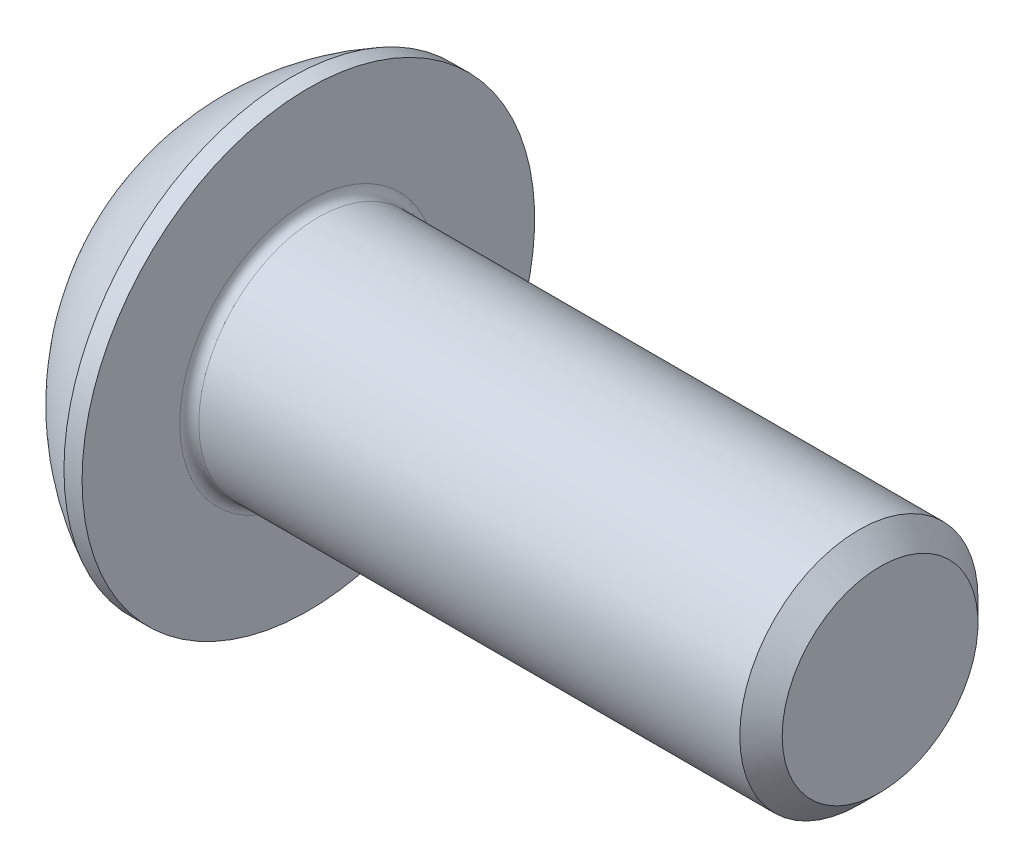
ISO-10303-21;
HEADER;
FILE_DESCRIPTION(('STEP AP214'),'2;1');
FILE_NAME('part.step','',(''),(''),'','','');
FILE_SCHEMA(('AUTOMOTIVE_DESIGN { 1 0 10303 214 1 1 1 1 }'));
ENDSEC;
DATA;
#1=APPLICATION_CONTEXT('core data for automotive mechanical design processes');
#2=APPLICATION_PROTOCOL_DEFINITION('international standard','automotive_design',2000,#1);
#3=PRODUCT_CONTEXT('',#1,'mechanical');
#4=PRODUCT('Part','Part','',(#3));
#5=PRODUCT_RELATED_PRODUCT_CATEGORY('part','',(#4));
#6=PRODUCT_DEFINITION_FORMATION('','',#4);
#7=PRODUCT_DEFINITION_CONTEXT('part definition',#1,'design');
#8=PRODUCT_DEFINITION('design','',#6,#7);
#9=PRODUCT_DEFINITION_SHAPE('','',#8);
#10=(LENGTH_UNIT() NAMED_UNIT(*) SI_UNIT(.MILLI.,.METRE.));
#11=(NAMED_UNIT(*) PLANE_ANGLE_UNIT() SI_UNIT($,.RADIAN.));
#12=(NAMED_UNIT(*) SI_UNIT($,.STERADIAN.) SOLID_ANGLE_UNIT());
#13=UNCERTAINTY_MEASURE_WITH_UNIT(LENGTH_MEASURE(1.E-05),#10,'distance_accuracy_value','');
#14=(GEOMETRIC_REPRESENTATION_CONTEXT(3) GLOBAL_UNCERTAINTY_ASSIGNED_CONTEXT((#13)) GLOBAL_UNIT_ASSIGNED_CONTEXT((#10,
#11,#12)) REPRESENTATION_CONTEXT('',''));
#15=CARTESIAN_POINT('',(0.,0.,0.));
#16=DIRECTION('',(0.,0.,1.));
#17=DIRECTION('',(1.,0.,0.));
#18=AXIS2_PLACEMENT_3D('',#15,#16,#17);
#19=CARTESIAN_POINT('',(0.,0.,0.));
#20=DIRECTION('',(-1.,0.,0.));
#21=DIRECTION('',(0.,0.,1.));
#22=AXIS2_PLACEMENT_3D('',#19,#20,#21);
#23=PLANE('',#22);
#24=CARTESIAN_POINT('',(0.,0.,0.));
#25=DIRECTION('',(-1.,0.,0.));
#26=DIRECTION('',(0.,0.,1.));
#27=AXIS2_PLACEMENT_3D('',#24,#25,#26);
#28=CIRCLE('',#27,2.375);
#29=CARTESIAN_POINT('',(0.,2.375,0.));
#30=VERTEX_POINT('',#29);
#31=EDGE_CURVE('E159',#30,#30,#28,.T.);
#32=ORIENTED_EDGE('',*,*,#31,.T.);
#33=EDGE_LOOP('',(#32));
#34=FACE_BOUND('',#33,.T.);
#35=DIRECTION('',(0.,-1.,0.));
#36=VECTOR('',#35,1.);
#37=CARTESIAN_POINT('',(0.,-0.866025403784438,1.5));
#38=LINE('',#37,#36);
#39=CARTESIAN_POINT('',(0.,0.86602540378444,1.5));
#40=VERTEX_POINT('',#39);
#41=CARTESIAN_POINT('',(0.,-0.866025403784438,1.5));
#42=VERTEX_POINT('',#41);
#43=EDGE_CURVE('E54',#40,#42,#38,.T.);
#44=ORIENTED_EDGE('',*,*,#43,.T.);
#45=DIRECTION('',(0.,-0.5,-0.866025403784439));
#46=VECTOR('',#45,1.);
#47=CARTESIAN_POINT('',(0.,-1.73205080756888,0.));
#48=LINE('',#47,#46);
#49=CARTESIAN_POINT('',(0.,-1.73205080756888,0.));
#50=VERTEX_POINT('',#49);
#51=EDGE_CURVE('E279',#42,#50,#48,.T.);
#52=ORIENTED_EDGE('',*,*,#51,.T.);
#53=DIRECTION('',(0.,0.5,-0.866025403784438));
#54=VECTOR('',#53,1.);
#55=CARTESIAN_POINT('',(0.,-0.866025403784438,-1.5));
#56=LINE('',#55,#54);
#57=CARTESIAN_POINT('',(0.,-0.866025403784438,-1.5));
#58=VERTEX_POINT('',#57);
#59=EDGE_CURVE('E134',#50,#58,#56,.T.);
#60=ORIENTED_EDGE('',*,*,#59,.T.);
#61=DIRECTION('',(0.,1.,0.));
#62=VECTOR('',#61,1.);
#63=CARTESIAN_POINT('',(0.,0.86602540378444,-1.5));
#64=LINE('',#63,#62);
#65=CARTESIAN_POINT('',(0.,0.86602540378444,-1.5));
#66=VERTEX_POINT('',#65);
#67=EDGE_CURVE('E282',#58,#66,#64,.T.);
#68=ORIENTED_EDGE('',*,*,#67,.T.);
#69=DIRECTION('',(0.,0.5,0.866025403784439));
#70=VECTOR('',#69,1.);
#71=CARTESIAN_POINT('',(0.,1.73205080756888,0.));
#72=LINE('',#71,#70);
#73=CARTESIAN_POINT('',(0.,1.73205080756888,0.));
#74=VERTEX_POINT('',#73);
#75=EDGE_CURVE('E284',#66,#74,#72,.T.);
#76=ORIENTED_EDGE('',*,*,#75,.T.);
#77=DIRECTION('',(0.,-0.5,0.866025403784439));
#78=VECTOR('',#77,1.);
#79=CARTESIAN_POINT('',(0.,0.86602540378444,1.5));
#80=LINE('',#79,#78);
#81=EDGE_CURVE('E286',#74,#40,#80,.T.);
#82=ORIENTED_EDGE('',*,*,#81,.T.);
#83=EDGE_LOOP('',(#44,#52,#60,#68,#76,#82));
#84=FACE_BOUND('',#83,.T.);
#85=ADVANCED_FACE('F39',(#34,#84),#23,.T.);
#86=CARTESIAN_POINT('',(4.75501582278481,0.,0.));
#87=DIRECTION('',(-1.,0.,0.));
#88=DIRECTION('',(0.,1.,0.));
#89=AXIS2_PLACEMENT_3D('',#86,#87,#88);
#90=SPHERICAL_SURFACE('',#89,5.3151482081814);
#91=CARTESIAN_POINT('',(2.37,0.,0.));
#92=DIRECTION('',(-1.,0.,0.));
#93=DIRECTION('',(0.,0.,1.));
#94=AXIS2_PLACEMENT_3D('',#91,#92,#93);
#95=CIRCLE('',#94,4.75);
#96=CARTESIAN_POINT('',(2.37,4.75,0.));
#97=VERTEX_POINT('',#96);
#98=EDGE_CURVE('E156',#97,#97,#95,.T.);
#99=CARTESIAN_POINT('',(2.37,4.75,0.));
#100=CARTESIAN_POINT('',(2.33822259048669,4.7340443473251,0.));
#101=CARTESIAN_POINT('',(2.30660534291523,4.71776971995817,0.));
#102=CARTESIAN_POINT('',(2.24370380094997,4.68458927158339,0.));
#103=CARTESIAN_POINT('',(2.21241950655618,4.66768345057554,0.));
#104=CARTESIAN_POINT('',(2.15019650024021,4.6332473706621,0.));
#105=CARTESIAN_POINT('',(2.11925778831804,4.6157171117565,0.));
#106=CARTESIAN_POINT('',(2.05773840110808,4.58003923142984,0.));
#107=CARTESIAN_POINT('',(2.02715772582028,4.56189161000878,0.));
#108=CARTESIAN_POINT('',(1.96636673145741,4.52498631044657,0.));
#109=CARTESIAN_POINT('',(1.93615641238234,4.50622863230541,0.));
#110=CARTESIAN_POINT('',(1.87611829826807,4.46811077571318,0.));
#111=CARTESIAN_POINT('',(1.84629050322888,4.4487505972621,0.));
#112=CARTESIAN_POINT('',(1.78702945162455,4.40943553782984,0.));
#113=CARTESIAN_POINT('',(1.75759619505941,4.38948065684865,0.));
#114=CARTESIAN_POINT('',(1.69913607574061,4.34898423002648,0.));
#115=CARTESIAN_POINT('',(1.67010921298694,4.32844268418548,0.));
#116=CARTESIAN_POINT('',(1.61247357298735,4.28678120152175,0.));
#117=CARTESIAN_POINT('',(1.58386479574144,4.265661264699,0.));
#118=CARTESIAN_POINT('',(1.52707685004032,4.22285150694424,0.));
#119=CARTESIAN_POINT('',(1.49889768158512,4.20116168601223,0.));
#120=CARTESIAN_POINT('',(1.44298030371049,4.15722089644741,0.));
#121=CARTESIAN_POINT('',(1.41524209429107,4.13496992781461,0.));
#122=CARTESIAN_POINT('',(1.36021780711889,4.08991580528235,0.));
#123=CARTESIAN_POINT('',(1.33293172936613,4.06711265138288,0.));
#124=CARTESIAN_POINT('',(1.278822696045,4.02096334316477,0.));
#125=CARTESIAN_POINT('',(1.25199974047662,3.99761718884614,0.));
#126=CARTESIAN_POINT('',(1.19882775550162,3.95039128335163,0.));
#127=CARTESIAN_POINT('',(1.172478726095,3.92651153217576,0.));
#128=CARTESIAN_POINT('',(1.1202652065289,3.87822805145535,0.));
#129=CARTESIAN_POINT('',(1.09440071636942,3.85382432191081,0.));
#130=CARTESIAN_POINT('',(1.04316669321618,3.8045027139941,0.));
#131=CARTESIAN_POINT('',(1.01779716022241,3.77958483562192,0.));
#132=CARTESIAN_POINT('',(0.9675632699561,3.72924496668416,0.));
#133=CARTESIAN_POINT('',(0.942698912683562,3.70382297611859,0.));
#134=CARTESIAN_POINT('',(0.89348538893628,3.65248512247887,0.));
#135=CARTESIAN_POINT('',(0.869136222461536,3.62656925940472,0.));
#136=CARTESIAN_POINT('',(0.82096288787349,3.57425409935884,0.));
#137=CARTESIAN_POINT('',(0.797138719760188,3.54785480238711,0.));
#138=CARTESIAN_POINT('',(0.750024977995378,3.49458340787865,0.));
#139=CARTESIAN_POINT('',(0.726735404343869,3.46771131034191,0.));
#140=CARTESIAN_POINT('',(0.680700232274541,3.41350513847464,0.));
#141=CARTESIAN_POINT('',(0.657954633856721,3.3861710641441,0.));
#142=CARTESIAN_POINT('',(0.613016573919583,3.33105194853939,0.));
#143=CARTESIAN_POINT('',(0.590824112400263,3.30326690726522,0.));
#144=CARTESIAN_POINT('',(0.547001265128254,3.24725704926748,0.));
#145=CARTESIAN_POINT('',(0.525370879375564,3.21903223254391,0.));
#146=CARTESIAN_POINT('',(0.48268089610549,3.16215419227901,0.));
#147=CARTESIAN_POINT('',(0.461621298588105,3.13350096873769,0.));
#148=CARTESIAN_POINT('',(0.420081374357154,3.07577765602272,0.));
#149=CARTESIAN_POINT('',(0.399601047643587,3.04670756684908,0.));
#150=CARTESIAN_POINT('',(0.359227914239947,2.98816223197683,0.));
#151=CARTESIAN_POINT('',(0.339335107549873,2.95868698627821,0.));
#152=CARTESIAN_POINT('',(0.300145026860787,2.89934321060632,0.));
#153=CARTESIAN_POINT('',(0.280847752861776,2.86947468063304,0.));
#154=CARTESIAN_POINT('',(0.242856509997139,2.80935636725696,0.));
#155=CARTESIAN_POINT('',(0.224162541131514,2.77910658385416,0.));
#156=CARTESIAN_POINT('',(0.187385439283607,2.71823794734018,0.));
#157=CARTESIAN_POINT('',(0.169302306301325,2.68761909422898,0.));
#158=CARTESIAN_POINT('',(0.133754156035989,2.626024653246,0.));
#159=CARTESIAN_POINT('',(0.116289138752934,2.59504906537422,0.));
#160=CARTESIAN_POINT('',(0.081984269005742,2.53275362391635,0.));
#161=CARTESIAN_POINT('',(0.0651444165416041,2.50143377033028,0.));
#162=CARTESIAN_POINT('',(0.03209660554443,2.43846244094735,0.));
#163=CARTESIAN_POINT('',(0.0158886470113938,2.40681096515049,0.));
#164=CARTESIAN_POINT('',(0.,2.375,0.));
#165=B_SPLINE_CURVE_WITH_KNOTS('',3,(#99,#100,#101,#102,#103,#104,#105,#106,#107,#108,#109,#110,
#111,#112,#113,#114,#115,#116,#117,#118,#119,#120,#121,#122,#123,#124,#125,#126,#127,#128,#129,
#130,#131,#132,#133,#134,#135,#136,#137,#138,#139,#140,#141,#142,#143,#144,#145,#146,#147,#148,
#149,#150,#151,#152,#153,#154,#155,#156,#157,#158,#159,#160,#161,#162,#163,#164),.UNSPECIFIED.,
.F.,.F.,(4,2,2,2,2,2,2,2,2,2,2,2,2,2,2,2,2,2,2,2,2,2,2,2,2,2,2,2,2,2,2,2,4),(0.,
0.106672849678272,0.213345699356545,0.320018549034817,0.426691398713089,0.533364248391363,
0.640037098069634,0.746709947747907,0.853382797426179,0.960055647104452,1.06672849678272,
1.173401346461,1.28007419613927,1.38674704581754,1.49341989549581,1.60009274517409,
1.70676559485236,1.81343844453063,1.9201112942089,2.02678414388718,2.13345699356545,
2.24012984324372,2.34680269292199,2.45347554260027,2.56014839227854,2.66682124195681,
2.77349409163508,2.88016694131336,2.98683979099163,3.0935126406699,3.20018549034817,
3.30685834002645,3.41353118970472),.UNSPECIFIED.);
#166=EDGE_CURVE('BSEAM180',#97,#30,#165,.T.);
#167=ORIENTED_EDGE('',*,*,#98,.T.);
#168=ORIENTED_EDGE('',*,*,#31,.F.);
#169=ORIENTED_EDGE('',*,*,#166,.T.);
#170=ORIENTED_EDGE('',*,*,#166,.F.);
#171=EDGE_LOOP('',(#167,#169,#168,#170));
#172=FACE_BOUND('',#171,.T.);
#173=ADVANCED_FACE('F180',(#172),#90,.T.);
#174=CARTESIAN_POINT('',(0.,0.,0.));
#175=DIRECTION('',(-1.,0.,0.));
#176=DIRECTION('',(0.,0.,1.));
#177=AXIS2_PLACEMENT_3D('',#174,#175,#176);
#178=CYLINDRICAL_SURFACE('',#177,4.75);
#179=ORIENTED_EDGE('',*,*,#98,.F.);
#180=EDGE_LOOP('',(#179));
#181=FACE_BOUND('',#180,.T.);
#182=CARTESIAN_POINT('',(2.75,0.,0.));
#183=DIRECTION('',(-1.,0.,0.));
#184=DIRECTION('',(0.,0.,1.));
#185=AXIS2_PLACEMENT_3D('',#182,#183,#184);
#186=CIRCLE('',#185,4.75);
#187=CARTESIAN_POINT('',(2.75,0.,4.75));
#188=VERTEX_POINT('',#187);
#189=EDGE_CURVE('E153',#188,#188,#186,.T.);
#190=ORIENTED_EDGE('',*,*,#189,.T.);
#191=EDGE_LOOP('',(#190));
#192=FACE_BOUND('',#191,.T.);
#193=ADVANCED_FACE('F185',(#181,#192),#178,.T.);
#194=CARTESIAN_POINT('',(2.75,2.49999999999999,0.));
#195=DIRECTION('',(-1.,0.,0.));
#196=DIRECTION('',(0.,0.,1.));
#197=AXIS2_PLACEMENT_3D('',#194,#195,#196);
#198=PLANE('',#197);
#199=CARTESIAN_POINT('',(2.75,0.,0.));
#200=DIRECTION('',(-1.,0.,0.));
#201=DIRECTION('',(0.,0.,1.));
#202=AXIS2_PLACEMENT_3D('',#199,#200,#201);
#203=CIRCLE('',#202,2.7);
#204=CARTESIAN_POINT('',(2.75,0.,2.7));
#205=VERTEX_POINT('',#204);
#206=EDGE_CURVE('E47',#205,#205,#203,.T.);
#207=ORIENTED_EDGE('',*,*,#206,.T.);
#208=EDGE_LOOP('',(#207));
#209=FACE_BOUND('',#208,.T.);
#210=ORIENTED_EDGE('',*,*,#189,.F.);
#211=EDGE_LOOP('',(#210));
#212=FACE_BOUND('',#211,.T.);
#213=ADVANCED_FACE('F164',(#209,#212),#198,.F.);
#214=CARTESIAN_POINT('',(0.,0.,0.));
#215=DIRECTION('',(-1.,0.,0.));
#216=DIRECTION('',(0.,0.,1.));
#217=AXIS2_PLACEMENT_3D('',#214,#215,#216);
#218=CYLINDRICAL_SURFACE('',#217,2.5);
#219=CARTESIAN_POINT('',(2.95,0.,0.));
#220=DIRECTION('',(-1.,0.,0.));
#221=DIRECTION('',(0.,0.,1.));
#222=AXIS2_PLACEMENT_3D('',#219,#220,#221);
#223=CIRCLE('',#222,2.5);
#224=CARTESIAN_POINT('',(2.95,0.,2.5));
#225=VERTEX_POINT('',#224);
#226=EDGE_CURVE('E11',#225,#225,#223,.F.);
#227=ORIENTED_EDGE('',*,*,#226,.T.);
#228=EDGE_LOOP('',(#227));
#229=FACE_BOUND('',#228,.T.);
#230=CARTESIAN_POINT('',(14.305,0.,0.));
#231=DIRECTION('',(-1.,0.,0.));
#232=DIRECTION('',(0.,0.,1.));
#233=AXIS2_PLACEMENT_3D('',#230,#231,#232);
#234=CIRCLE('',#233,2.5);
#235=CARTESIAN_POINT('',(14.305,0.,2.5));
#236=VERTEX_POINT('',#235);
#237=EDGE_CURVE('E150',#236,#236,#234,.T.);
#238=ORIENTED_EDGE('',*,*,#237,.T.);
#239=EDGE_LOOP('',(#238));
#240=FACE_BOUND('',#239,.T.);
#241=ADVANCED_FACE('F194',(#229,#240),#218,.T.);
#242=CARTESIAN_POINT('',(14.75,0.,0.));
#243=DIRECTION('',(-1.,0.,0.));
#244=DIRECTION('',(0.,0.,1.));
#245=AXIS2_PLACEMENT_3D('',#242,#243,#244);
#246=CONICAL_SURFACE('',#245,2.055,0.785398163397446);
#247=ORIENTED_EDGE('',*,*,#237,.F.);
#248=EDGE_LOOP('',(#247));
#249=FACE_BOUND('',#248,.T.);
#250=CARTESIAN_POINT('',(14.75,0.,0.));
#251=DIRECTION('',(-1.,0.,0.));
#252=DIRECTION('',(0.,0.,1.));
#253=AXIS2_PLACEMENT_3D('',#250,#251,#252);
#254=CIRCLE('',#253,2.055);
#255=CARTESIAN_POINT('',(14.75,0.,2.055));
#256=VERTEX_POINT('',#255);
#257=EDGE_CURVE('E146',#256,#256,#254,.T.);
#258=ORIENTED_EDGE('',*,*,#257,.T.);
#259=EDGE_LOOP('',(#258));
#260=FACE_BOUND('',#259,.T.);
#261=ADVANCED_FACE('F175',(#249,#260),#246,.T.);
#262=CARTESIAN_POINT('',(14.75,0.,0.));
#263=DIRECTION('',(-1.,0.,0.));
#264=DIRECTION('',(0.,0.,1.));
#265=AXIS2_PLACEMENT_3D('',#262,#263,#264);
#266=PLANE('',#265);
#267=ORIENTED_EDGE('',*,*,#257,.F.);
#268=EDGE_LOOP('',(#267));
#269=FACE_BOUND('',#268,.T.);
#270=ADVANCED_FACE('F168',(#269),#266,.F.);
#271=CARTESIAN_POINT('',(2.95,0.,0.));
#272=DIRECTION('',(-1.,0.,0.));
#273=DIRECTION('',(0.,0.,1.));
#274=AXIS2_PLACEMENT_3D('',#271,#272,#273);
#275=TOROIDAL_SURFACE('',#274,2.7,0.2);
#276=ORIENTED_EDGE('',*,*,#226,.F.);
#277=EDGE_LOOP('',(#276));
#278=FACE_BOUND('',#277,.T.);
#279=ORIENTED_EDGE('',*,*,#206,.F.);
#280=EDGE_LOOP('',(#279));
#281=FACE_BOUND('',#280,.T.);
#282=ADVANCED_FACE('F41',(#278,#281),#275,.F.);
#283=CARTESIAN_POINT('',(1.56,-1.73205080756888,0.));
#284=DIRECTION('',(0.,0.866025403784438,-0.5));
#285=DIRECTION('',(0.,0.5,0.866025403784439));
#286=AXIS2_PLACEMENT_3D('',#283,#284,#285);
#287=PLANE('',#286);
#288=DIRECTION('',(0.,-0.5,-0.866025403784439));
#289=VECTOR('',#288,1.);
#290=CARTESIAN_POINT('',(1.56,-1.73205080756888,0.));
#291=LINE('',#290,#289);
#292=CARTESIAN_POINT('',(1.56,-0.866025403784438,1.5));
#293=VERTEX_POINT('',#292);
#294=CARTESIAN_POINT('',(1.56,-1.29903810567666,0.75));
#295=VERTEX_POINT('',#294);
#296=EDGE_CURVE('E120',#293,#295,#291,.T.);
#297=ORIENTED_EDGE('',*,*,#296,.T.);
#298=CARTESIAN_POINT('',(1.56,-1.73205080756888,0.));
#299=VERTEX_POINT('',#298);
#300=EDGE_CURVE('E115',#295,#299,#291,.T.);
#301=ORIENTED_EDGE('',*,*,#300,.T.);
#302=DIRECTION('',(-1.,0.,0.));
#303=VECTOR('',#302,1.);
#304=CARTESIAN_POINT('',(1.56,-1.73205080756888,0.));
#305=LINE('',#304,#303);
#306=EDGE_CURVE('E117',#299,#50,#305,.T.);
#307=ORIENTED_EDGE('',*,*,#306,.T.);
#308=ORIENTED_EDGE('',*,*,#51,.F.);
#309=DIRECTION('',(-1.,0.,0.));
#310=VECTOR('',#309,1.);
#311=CARTESIAN_POINT('',(1.56,-0.866025403784438,1.5));
#312=LINE('',#311,#310);
#313=EDGE_CURVE('E275',#293,#42,#312,.T.);
#314=ORIENTED_EDGE('',*,*,#313,.F.);
#315=EDGE_LOOP('',(#297,#301,#307,#308,#314));
#316=FACE_BOUND('',#315,.T.);
#317=ADVANCED_FACE('F116',(#316),#287,.T.);
#318=CARTESIAN_POINT('',(1.56,-0.866025403784438,-1.5));
#319=DIRECTION('',(0.,0.866025403784438,0.5));
#320=DIRECTION('',(0.,-0.5,0.866025403784439));
#321=AXIS2_PLACEMENT_3D('',#318,#319,#320);
#322=PLANE('',#321);
#323=DIRECTION('',(0.,0.5,-0.866025403784438));
#324=VECTOR('',#323,1.);
#325=CARTESIAN_POINT('',(1.56,-0.866025403784438,-1.5));
#326=LINE('',#325,#324);
#327=CARTESIAN_POINT('',(1.56,-1.29903810567666,-0.75));
#328=VERTEX_POINT('',#327);
#329=EDGE_CURVE('E62',#299,#328,#326,.T.);
#330=ORIENTED_EDGE('',*,*,#329,.T.);
#331=CARTESIAN_POINT('',(1.56,-0.866025403784438,-1.5));
#332=VERTEX_POINT('',#331);
#333=EDGE_CURVE('E129',#328,#332,#326,.T.);
#334=ORIENTED_EDGE('',*,*,#333,.T.);
#335=DIRECTION('',(-1.,0.,0.));
#336=VECTOR('',#335,1.);
#337=CARTESIAN_POINT('',(1.56,-0.866025403784438,-1.5));
#338=LINE('',#337,#336);
#339=EDGE_CURVE('E136',#332,#58,#338,.T.);
#340=ORIENTED_EDGE('',*,*,#339,.T.);
#341=ORIENTED_EDGE('',*,*,#59,.F.);
#342=ORIENTED_EDGE('',*,*,#306,.F.);
#343=EDGE_LOOP('',(#330,#334,#340,#341,#342));
#344=FACE_BOUND('',#343,.T.);
#345=ADVANCED_FACE('F132',(#344),#322,.T.);
#346=CARTESIAN_POINT('',(1.56,0.86602540378444,-1.5));
#347=DIRECTION('',(0.,0.,1.));
#348=DIRECTION('',(0.,-1.,0.));
#349=AXIS2_PLACEMENT_3D('',#346,#347,#348);
#350=PLANE('',#349);
#351=DIRECTION('',(0.,1.,0.));
#352=VECTOR('',#351,1.);
#353=CARTESIAN_POINT('',(1.56,0.86602540378444,-1.5));
#354=LINE('',#353,#352);
#355=CARTESIAN_POINT('',(1.56,0.,-1.5));
#356=VERTEX_POINT('',#355);
#357=EDGE_CURVE('E256',#332,#356,#354,.T.);
#358=ORIENTED_EDGE('',*,*,#357,.T.);
#359=CARTESIAN_POINT('',(1.56,0.86602540378444,-1.5));
#360=VERTEX_POINT('',#359);
#361=EDGE_CURVE('E128',#356,#360,#354,.T.);
#362=ORIENTED_EDGE('',*,*,#361,.T.);
#363=DIRECTION('',(-1.,0.,0.));
#364=VECTOR('',#363,1.);
#365=CARTESIAN_POINT('',(1.56,0.86602540378444,-1.5));
#366=LINE('',#365,#364);
#367=EDGE_CURVE('E141',#360,#66,#366,.T.);
#368=ORIENTED_EDGE('',*,*,#367,.T.);
#369=ORIENTED_EDGE('',*,*,#67,.F.);
#370=ORIENTED_EDGE('',*,*,#339,.F.);
#371=EDGE_LOOP('',(#358,#362,#368,#369,#370));
#372=FACE_BOUND('',#371,.T.);
#373=ADVANCED_FACE('F208',(#372),#350,.T.);
#374=CARTESIAN_POINT('',(1.56,1.73205080756888,0.));
#375=DIRECTION('',(0.,-0.866025403784439,0.5));
#376=DIRECTION('',(0.,-0.5,-0.866025403784439));
#377=AXIS2_PLACEMENT_3D('',#374,#375,#376);
#378=PLANE('',#377);
#379=DIRECTION('',(0.,0.5,0.866025403784439));
#380=VECTOR('',#379,1.);
#381=CARTESIAN_POINT('',(1.56,1.73205080756888,0.));
#382=LINE('',#381,#380);
#383=CARTESIAN_POINT('',(1.56,1.29903810567666,-0.750000000000001));
#384=VERTEX_POINT('',#383);
#385=EDGE_CURVE('E245',#360,#384,#382,.T.);
#386=ORIENTED_EDGE('',*,*,#385,.T.);
#387=CARTESIAN_POINT('',(1.56,1.73205080756888,0.));
#388=VERTEX_POINT('',#387);
#389=EDGE_CURVE('E250',#384,#388,#382,.T.);
#390=ORIENTED_EDGE('',*,*,#389,.T.);
#391=DIRECTION('',(-1.,0.,0.));
#392=VECTOR('',#391,1.);
#393=CARTESIAN_POINT('',(1.56,1.73205080756888,0.));
#394=LINE('',#393,#392);
#395=EDGE_CURVE('E290',#388,#74,#394,.T.);
#396=ORIENTED_EDGE('',*,*,#395,.T.);
#397=ORIENTED_EDGE('',*,*,#75,.F.);
#398=ORIENTED_EDGE('',*,*,#367,.F.);
#399=EDGE_LOOP('',(#386,#390,#396,#397,#398));
#400=FACE_BOUND('',#399,.T.);
#401=ADVANCED_FACE('F211',(#400),#378,.T.);
#402=CARTESIAN_POINT('',(1.56,0.86602540378444,1.5));
#403=DIRECTION('',(0.,-0.866025403784439,-0.5));
#404=DIRECTION('',(0.,0.5,-0.866025403784439));
#405=AXIS2_PLACEMENT_3D('',#402,#403,#404);
#406=PLANE('',#405);
#407=DIRECTION('',(0.,-0.5,0.866025403784439));
#408=VECTOR('',#407,1.);
#409=CARTESIAN_POINT('',(1.56,0.86602540378444,1.5));
#410=LINE('',#409,#408);
#411=CARTESIAN_POINT('',(1.56,1.29903810567666,0.75));
#412=VERTEX_POINT('',#411);
#413=EDGE_CURVE('E253',#388,#412,#410,.T.);
#414=ORIENTED_EDGE('',*,*,#413,.T.);
#415=CARTESIAN_POINT('',(1.56,0.86602540378444,1.5));
#416=VERTEX_POINT('',#415);
#417=EDGE_CURVE('E261',#412,#416,#410,.T.);
#418=ORIENTED_EDGE('',*,*,#417,.T.);
#419=DIRECTION('',(-1.,0.,0.));
#420=VECTOR('',#419,1.);
#421=CARTESIAN_POINT('',(1.56,0.86602540378444,1.5));
#422=LINE('',#421,#420);
#423=EDGE_CURVE('E274',#416,#40,#422,.T.);
#424=ORIENTED_EDGE('',*,*,#423,.T.);
#425=ORIENTED_EDGE('',*,*,#81,.F.);
#426=ORIENTED_EDGE('',*,*,#395,.F.);
#427=EDGE_LOOP('',(#414,#418,#424,#425,#426));
#428=FACE_BOUND('',#427,.T.);
#429=ADVANCED_FACE('F215',(#428),#406,.T.);
#430=CARTESIAN_POINT('',(1.56,-0.866025403784438,1.5));
#431=DIRECTION('',(0.,0.,-1.));
#432=DIRECTION('',(0.,1.,0.));
#433=AXIS2_PLACEMENT_3D('',#430,#431,#432);
#434=PLANE('',#433);
#435=DIRECTION('',(0.,-1.,0.));
#436=VECTOR('',#435,1.);
#437=CARTESIAN_POINT('',(1.56,-0.866025403784438,1.5));
#438=LINE('',#437,#436);
#439=CARTESIAN_POINT('',(1.56,0.,1.5));
#440=VERTEX_POINT('',#439);
#441=EDGE_CURVE('E267',#416,#440,#438,.T.);
#442=ORIENTED_EDGE('',*,*,#441,.T.);
#443=EDGE_CURVE('E269',#440,#293,#438,.T.);
#444=ORIENTED_EDGE('',*,*,#443,.T.);
#445=ORIENTED_EDGE('',*,*,#313,.T.);
#446=ORIENTED_EDGE('',*,*,#43,.F.);
#447=ORIENTED_EDGE('',*,*,#423,.F.);
#448=EDGE_LOOP('',(#442,#444,#445,#446,#447));
#449=FACE_BOUND('',#448,.T.);
#450=ADVANCED_FACE('F219',(#449),#434,.T.);
#451=CARTESIAN_POINT('',(1.56,-1.73205080756888,0.));
#452=DIRECTION('',(1.,0.,0.));
#453=DIRECTION('',(0.,0.,-1.));
#454=AXIS2_PLACEMENT_3D('',#451,#452,#453);
#455=PLANE('',#454);
#456=CARTESIAN_POINT('',(1.56,0.,0.));
#457=DIRECTION('',(-1.,0.,0.));
#458=DIRECTION('',(0.,0.,1.));
#459=AXIS2_PLACEMENT_3D('',#456,#457,#458);
#460=CIRCLE('',#459,1.5);
#461=EDGE_CURVE('E242',#384,#356,#460,.T.);
#462=ORIENTED_EDGE('',*,*,#461,.F.);
#463=ORIENTED_EDGE('',*,*,#385,.F.);
#464=ORIENTED_EDGE('',*,*,#361,.F.);
#465=EDGE_LOOP('',(#462,#463,#464));
#466=FACE_BOUND('',#465,.T.);
#467=ADVANCED_FACE('F223',(#466),#455,.F.);
#468=EDGE_CURVE('E147',#412,#384,#460,.T.);
#469=ORIENTED_EDGE('',*,*,#468,.F.);
#470=ORIENTED_EDGE('',*,*,#413,.F.);
#471=ORIENTED_EDGE('',*,*,#389,.F.);
#472=EDGE_LOOP('',(#469,#470,#471));
#473=FACE_BOUND('',#472,.T.);
#474=ADVANCED_FACE('F232',(#473),#455,.F.);
#475=EDGE_CURVE('E140',#440,#412,#460,.T.);
#476=ORIENTED_EDGE('',*,*,#475,.F.);
#477=ORIENTED_EDGE('',*,*,#441,.F.);
#478=ORIENTED_EDGE('',*,*,#417,.F.);
#479=EDGE_LOOP('',(#476,#477,#478));
#480=FACE_BOUND('',#479,.T.);
#481=ADVANCED_FACE('F237',(#480),#455,.F.);
#482=EDGE_CURVE('E135',#295,#440,#460,.T.);
#483=ORIENTED_EDGE('',*,*,#482,.F.);
#484=ORIENTED_EDGE('',*,*,#296,.F.);
#485=ORIENTED_EDGE('',*,*,#443,.F.);
#486=EDGE_LOOP('',(#483,#484,#485));
#487=FACE_BOUND('',#486,.T.);
#488=ADVANCED_FACE('F230',(#487),#455,.F.);
#489=EDGE_CURVE('E126',#328,#295,#460,.T.);
#490=ORIENTED_EDGE('',*,*,#489,.F.);
#491=ORIENTED_EDGE('',*,*,#329,.F.);
#492=ORIENTED_EDGE('',*,*,#300,.F.);
#493=EDGE_LOOP('',(#490,#491,#492));
#494=FACE_BOUND('',#493,.T.);
#495=ADVANCED_FACE('F125',(#494),#455,.F.);
#496=EDGE_CURVE('E248',#356,#328,#460,.T.);
#497=ORIENTED_EDGE('',*,*,#496,.F.);
#498=ORIENTED_EDGE('',*,*,#357,.F.);
#499=ORIENTED_EDGE('',*,*,#333,.F.);
#500=EDGE_LOOP('',(#497,#498,#499));
#501=FACE_BOUND('',#500,.T.);
#502=ADVANCED_FACE('F203',(#501),#455,.F.);
#503=CARTESIAN_POINT('',(2.42602540378445,0.,0.));
#504=DIRECTION('',(-1.,0.,0.));
#505=DIRECTION('',(0.,0.,1.));
#506=AXIS2_PLACEMENT_3D('',#503,#504,#505);
#507=CONICAL_SURFACE('',#506,0.,1.04719755119659);
#508=ORIENTED_EDGE('',*,*,#475,.T.);
#509=ORIENTED_EDGE('',*,*,#468,.T.);
#510=ORIENTED_EDGE('',*,*,#461,.T.);
#511=ORIENTED_EDGE('',*,*,#496,.T.);
#512=ORIENTED_EDGE('',*,*,#489,.T.);
#513=ORIENTED_EDGE('',*,*,#482,.T.);
#514=EDGE_LOOP('',(#508,#509,#510,#511,#512,#513));
#515=FACE_BOUND('',#514,.T.);
#516=CARTESIAN_POINT('',(2.42602540378445,0.,0.));
#517=VERTEX_POINT('',#516);
#518=VERTEX_LOOP('',#517);
#519=FACE_BOUND('',#518,.T.);
#520=ADVANCED_FACE('F201',(#515,#519),#507,.F.);
#521=CLOSED_SHELL('',(#85,#173,#193,#213,#241,#261,#270,#282,#317,#345,#373,#401,#429,#450,#467,
#474,#481,#488,#495,#502,#520));
#522=MANIFOLD_SOLID_BREP('B2',#521);
#523=ADVANCED_BREP_SHAPE_REPRESENTATION('',(#18,#522),#14);
#524=SHAPE_DEFINITION_REPRESENTATION(#9,#523);
ENDSEC;
END-ISO-10303-21;
